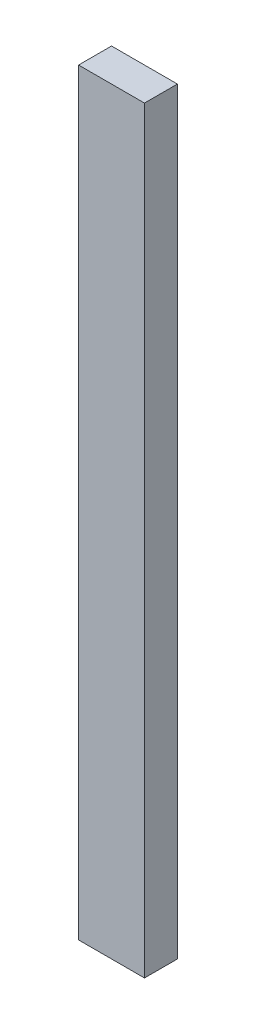
ISO-10303-21;
HEADER;
FILE_DESCRIPTION(('STEP AP214'),'2;1');
FILE_NAME('part.step','',(''),(''),'','','');
FILE_SCHEMA(('AUTOMOTIVE_DESIGN { 1 0 10303 214 1 1 1 1 }'));
ENDSEC;
DATA;
#1=APPLICATION_CONTEXT('core data for automotive mechanical design processes');
#2=APPLICATION_PROTOCOL_DEFINITION('international standard','automotive_design',2000,#1);
#3=PRODUCT_CONTEXT('',#1,'mechanical');
#4=PRODUCT('Part','Part','',(#3));
#5=PRODUCT_RELATED_PRODUCT_CATEGORY('part','',(#4));
#6=PRODUCT_DEFINITION_FORMATION('','',#4);
#7=PRODUCT_DEFINITION_CONTEXT('part definition',#1,'design');
#8=PRODUCT_DEFINITION('design','',#6,#7);
#9=PRODUCT_DEFINITION_SHAPE('','',#8);
#10=(LENGTH_UNIT() NAMED_UNIT(*) SI_UNIT(.MILLI.,.METRE.));
#11=(NAMED_UNIT(*) PLANE_ANGLE_UNIT() SI_UNIT($,.RADIAN.));
#12=(NAMED_UNIT(*) SI_UNIT($,.STERADIAN.) SOLID_ANGLE_UNIT());
#13=UNCERTAINTY_MEASURE_WITH_UNIT(LENGTH_MEASURE(1.E-05),#10,'distance_accuracy_value','');
#14=(GEOMETRIC_REPRESENTATION_CONTEXT(3) GLOBAL_UNCERTAINTY_ASSIGNED_CONTEXT((#13)) GLOBAL_UNIT_ASSIGNED_CONTEXT((#10,
#11,#12)) REPRESENTATION_CONTEXT('',''));
#15=CARTESIAN_POINT('',(0.,0.,0.));
#16=DIRECTION('',(0.,0.,1.));
#17=DIRECTION('',(1.,0.,0.));
#18=AXIS2_PLACEMENT_3D('',#15,#16,#17);
#19=CARTESIAN_POINT('',(0.,292.1,0.));
#20=DIRECTION('',(1.,0.,0.));
#21=DIRECTION('',(0.,0.,-1.));
#22=AXIS2_PLACEMENT_3D('',#19,#20,#21);
#23=PLANE('',#22);
#24=DIRECTION('',(0.,0.,1.));
#25=VECTOR('',#24,1.);
#26=CARTESIAN_POINT('',(0.,0.,0.));
#27=LINE('',#26,#25);
#28=CARTESIAN_POINT('',(0.,0.,-12.7));
#29=VERTEX_POINT('',#28);
#30=CARTESIAN_POINT('',(0.,0.,0.));
#31=VERTEX_POINT('',#30);
#32=EDGE_CURVE('E113',#29,#31,#27,.T.);
#33=ORIENTED_EDGE('',*,*,#32,.T.);
#34=DIRECTION('',(0.,-1.,0.));
#35=VECTOR('',#34,1.);
#36=CARTESIAN_POINT('',(0.,292.1,0.));
#37=LINE('',#36,#35);
#38=CARTESIAN_POINT('',(0.,292.1,0.));
#39=VERTEX_POINT('',#38);
#40=EDGE_CURVE('E11',#39,#31,#37,.T.);
#41=ORIENTED_EDGE('',*,*,#40,.F.);
#42=DIRECTION('',(0.,0.,1.));
#43=VECTOR('',#42,1.);
#44=CARTESIAN_POINT('',(0.,292.1,0.));
#45=LINE('',#44,#43);
#46=CARTESIAN_POINT('',(0.,292.1,-12.7));
#47=VERTEX_POINT('',#46);
#48=EDGE_CURVE('E97',#47,#39,#45,.T.);
#49=ORIENTED_EDGE('',*,*,#48,.F.);
#50=DIRECTION('',(0.,-1.,0.));
#51=VECTOR('',#50,1.);
#52=CARTESIAN_POINT('',(0.,292.1,-12.7));
#53=LINE('',#52,#51);
#54=EDGE_CURVE('E109',#47,#29,#53,.T.);
#55=ORIENTED_EDGE('',*,*,#54,.T.);
#56=EDGE_LOOP('',(#33,#41,#49,#55));
#57=FACE_BOUND('',#56,.T.);
#58=ADVANCED_FACE('F45',(#57),#23,.F.);
#59=CARTESIAN_POINT('',(0.,292.1,0.));
#60=DIRECTION('',(0.,0.,-1.));
#61=DIRECTION('',(-1.,0.,0.));
#62=AXIS2_PLACEMENT_3D('',#59,#60,#61);
#63=PLANE('',#62);
#64=DIRECTION('',(1.,0.,0.));
#65=VECTOR('',#64,1.);
#66=CARTESIAN_POINT('',(0.,0.,0.));
#67=LINE('',#66,#65);
#68=CARTESIAN_POINT('',(25.4,0.,0.));
#69=VERTEX_POINT('',#68);
#70=EDGE_CURVE('E102',#31,#69,#67,.T.);
#71=ORIENTED_EDGE('',*,*,#70,.T.);
#72=DIRECTION('',(0.,-1.,0.));
#73=VECTOR('',#72,1.);
#74=CARTESIAN_POINT('',(25.4,292.1,0.));
#75=LINE('',#74,#73);
#76=CARTESIAN_POINT('',(25.4,292.1,0.));
#77=VERTEX_POINT('',#76);
#78=EDGE_CURVE('E54',#77,#69,#75,.T.);
#79=ORIENTED_EDGE('',*,*,#78,.F.);
#80=DIRECTION('',(1.,0.,0.));
#81=VECTOR('',#80,1.);
#82=CARTESIAN_POINT('',(0.,292.1,0.));
#83=LINE('',#82,#81);
#84=EDGE_CURVE('E92',#39,#77,#83,.T.);
#85=ORIENTED_EDGE('',*,*,#84,.F.);
#86=ORIENTED_EDGE('',*,*,#40,.T.);
#87=EDGE_LOOP('',(#71,#79,#85,#86));
#88=FACE_BOUND('',#87,.T.);
#89=ADVANCED_FACE('F101',(#88),#63,.F.);
#90=CARTESIAN_POINT('',(25.4,292.1,0.));
#91=DIRECTION('',(-1.,0.,0.));
#92=DIRECTION('',(0.,0.,1.));
#93=AXIS2_PLACEMENT_3D('',#90,#91,#92);
#94=PLANE('',#93);
#95=DIRECTION('',(0.,0.,-1.));
#96=VECTOR('',#95,1.);
#97=CARTESIAN_POINT('',(25.4,0.,0.));
#98=LINE('',#97,#96);
#99=CARTESIAN_POINT('',(25.4,0.,-12.7));
#100=VERTEX_POINT('',#99);
#101=EDGE_CURVE('E79',#69,#100,#98,.T.);
#102=ORIENTED_EDGE('',*,*,#101,.T.);
#103=DIRECTION('',(0.,-1.,0.));
#104=VECTOR('',#103,1.);
#105=CARTESIAN_POINT('',(25.4,292.1,-12.7));
#106=LINE('',#105,#104);
#107=CARTESIAN_POINT('',(25.4,292.1,-12.7));
#108=VERTEX_POINT('',#107);
#109=EDGE_CURVE('E104',#108,#100,#106,.T.);
#110=ORIENTED_EDGE('',*,*,#109,.F.);
#111=DIRECTION('',(0.,0.,-1.));
#112=VECTOR('',#111,1.);
#113=CARTESIAN_POINT('',(25.4,292.1,0.));
#114=LINE('',#113,#112);
#115=EDGE_CURVE('E95',#77,#108,#114,.T.);
#116=ORIENTED_EDGE('',*,*,#115,.F.);
#117=ORIENTED_EDGE('',*,*,#78,.T.);
#118=EDGE_LOOP('',(#102,#110,#116,#117));
#119=FACE_BOUND('',#118,.T.);
#120=ADVANCED_FACE('F105',(#119),#94,.F.);
#121=CARTESIAN_POINT('',(0.,292.1,-12.7));
#122=DIRECTION('',(0.,0.,1.));
#123=DIRECTION('',(1.,0.,0.));
#124=AXIS2_PLACEMENT_3D('',#121,#122,#123);
#125=PLANE('',#124);
#126=DIRECTION('',(-1.,0.,0.));
#127=VECTOR('',#126,1.);
#128=CARTESIAN_POINT('',(0.,0.,-12.7));
#129=LINE('',#128,#127);
#130=EDGE_CURVE('E85',#100,#29,#129,.T.);
#131=ORIENTED_EDGE('',*,*,#130,.T.);
#132=ORIENTED_EDGE('',*,*,#54,.F.);
#133=DIRECTION('',(-1.,0.,0.));
#134=VECTOR('',#133,1.);
#135=CARTESIAN_POINT('',(0.,292.1,-12.7));
#136=LINE('',#135,#134);
#137=EDGE_CURVE('E62',#108,#47,#136,.T.);
#138=ORIENTED_EDGE('',*,*,#137,.F.);
#139=ORIENTED_EDGE('',*,*,#109,.T.);
#140=EDGE_LOOP('',(#131,#132,#138,#139));
#141=FACE_BOUND('',#140,.T.);
#142=ADVANCED_FACE('F126',(#141),#125,.F.);
#143=CARTESIAN_POINT('',(0.,292.1,0.));
#144=DIRECTION('',(0.,-1.,0.));
#145=DIRECTION('',(0.,0.,-1.));
#146=AXIS2_PLACEMENT_3D('',#143,#144,#145);
#147=PLANE('',#146);
#148=ORIENTED_EDGE('',*,*,#48,.T.);
#149=ORIENTED_EDGE('',*,*,#84,.T.);
#150=ORIENTED_EDGE('',*,*,#115,.T.);
#151=ORIENTED_EDGE('',*,*,#137,.T.);
#152=EDGE_LOOP('',(#148,#149,#150,#151));
#153=FACE_BOUND('',#152,.T.);
#154=ADVANCED_FACE('F93',(#153),#147,.F.);
#155=CARTESIAN_POINT('',(0.,0.,0.));
#156=DIRECTION('',(0.,-1.,0.));
#157=DIRECTION('',(0.,0.,-1.));
#158=AXIS2_PLACEMENT_3D('',#155,#156,#157);
#159=PLANE('',#158);
#160=ORIENTED_EDGE('',*,*,#32,.F.);
#161=ORIENTED_EDGE('',*,*,#130,.F.);
#162=ORIENTED_EDGE('',*,*,#101,.F.);
#163=ORIENTED_EDGE('',*,*,#70,.F.);
#164=EDGE_LOOP('',(#160,#161,#162,#163));
#165=FACE_BOUND('',#164,.T.);
#166=ADVANCED_FACE('F129',(#165),#159,.T.);
#167=CLOSED_SHELL('',(#58,#89,#120,#142,#154,#166));
#168=MANIFOLD_SOLID_BREP('B2',#167);
#169=ADVANCED_BREP_SHAPE_REPRESENTATION('',(#18,#168),#14);
#170=SHAPE_DEFINITION_REPRESENTATION(#9,#169);
ENDSEC;
END-ISO-10303-21;
